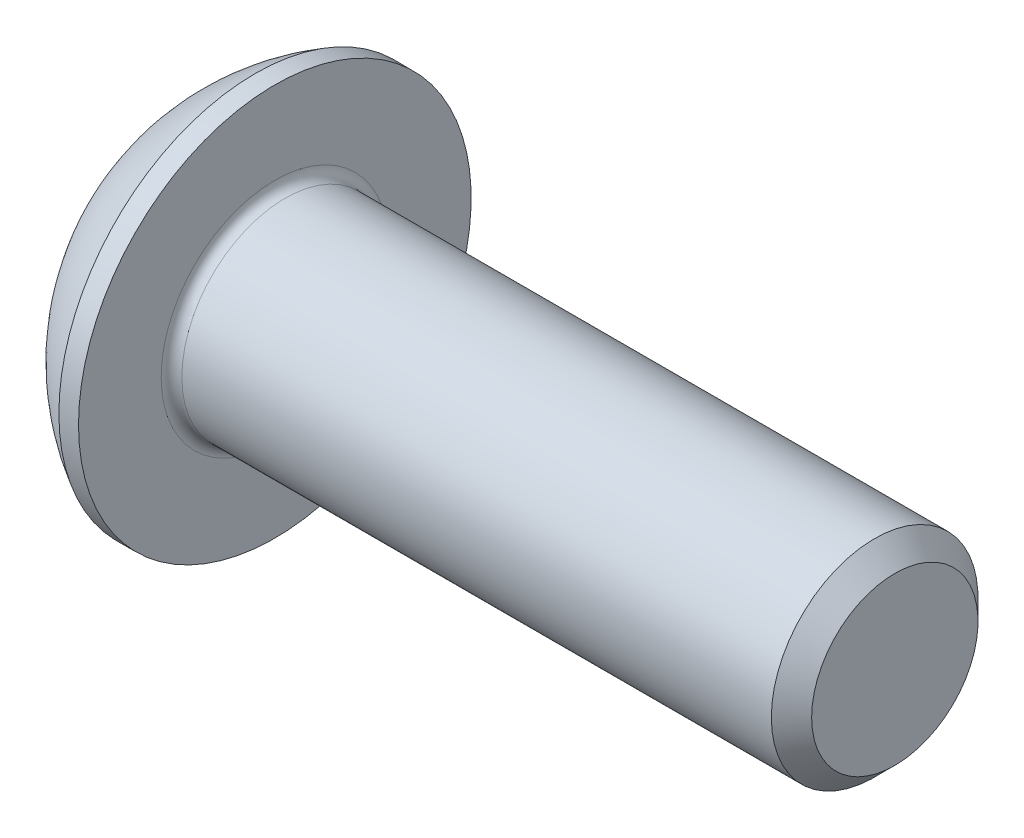
ISO-10303-21;
HEADER;
FILE_DESCRIPTION(('STEP AP214'),'2;1');
FILE_NAME('part.step','',(''),(''),'','','');
FILE_SCHEMA(('AUTOMOTIVE_DESIGN { 1 0 10303 214 1 1 1 1 }'));
ENDSEC;
DATA;
#1=APPLICATION_CONTEXT('core data for automotive mechanical design processes');
#2=APPLICATION_PROTOCOL_DEFINITION('international standard','automotive_design',2000,#1);
#3=PRODUCT_CONTEXT('',#1,'mechanical');
#4=PRODUCT('Part','Part','',(#3));
#5=PRODUCT_RELATED_PRODUCT_CATEGORY('part','',(#4));
#6=PRODUCT_DEFINITION_FORMATION('','',#4);
#7=PRODUCT_DEFINITION_CONTEXT('part definition',#1,'design');
#8=PRODUCT_DEFINITION('design','',#6,#7);
#9=PRODUCT_DEFINITION_SHAPE('','',#8);
#10=(LENGTH_UNIT() NAMED_UNIT(*) SI_UNIT(.MILLI.,.METRE.));
#11=(NAMED_UNIT(*) PLANE_ANGLE_UNIT() SI_UNIT($,.RADIAN.));
#12=(NAMED_UNIT(*) SI_UNIT($,.STERADIAN.) SOLID_ANGLE_UNIT());
#13=UNCERTAINTY_MEASURE_WITH_UNIT(LENGTH_MEASURE(1.E-05),#10,'distance_accuracy_value','');
#14=(GEOMETRIC_REPRESENTATION_CONTEXT(3) GLOBAL_UNCERTAINTY_ASSIGNED_CONTEXT((#13)) GLOBAL_UNIT_ASSIGNED_CONTEXT((#10,
#11,#12)) REPRESENTATION_CONTEXT('',''));
#15=CARTESIAN_POINT('',(0.,0.,0.));
#16=DIRECTION('',(0.,0.,1.));
#17=DIRECTION('',(1.,0.,0.));
#18=AXIS2_PLACEMENT_3D('',#15,#16,#17);
#19=CARTESIAN_POINT('',(0.,0.,0.));
#20=DIRECTION('',(-1.,0.,0.));
#21=DIRECTION('',(0.,0.,1.));
#22=AXIS2_PLACEMENT_3D('',#19,#20,#21);
#23=PLANE('',#22);
#24=CARTESIAN_POINT('',(0.,0.,0.));
#25=DIRECTION('',(-1.,0.,0.));
#26=DIRECTION('',(0.,0.,1.));
#27=AXIS2_PLACEMENT_3D('',#24,#25,#26);
#28=CIRCLE('',#27,1.9);
#29=CARTESIAN_POINT('',(0.,1.9,0.));
#30=VERTEX_POINT('',#29);
#31=EDGE_CURVE('E155',#30,#30,#28,.T.);
#32=ORIENTED_EDGE('',*,*,#31,.T.);
#33=EDGE_LOOP('',(#32));
#34=FACE_BOUND('',#33,.T.);
#35=DIRECTION('',(0.,-1.,0.));
#36=VECTOR('',#35,1.);
#37=CARTESIAN_POINT('',(0.,-0.721687836487032,1.25));
#38=LINE('',#37,#36);
#39=CARTESIAN_POINT('',(0.,0.721687836487034,1.25));
#40=VERTEX_POINT('',#39);
#41=CARTESIAN_POINT('',(0.,-0.721687836487032,1.25));
#42=VERTEX_POINT('',#41);
#43=EDGE_CURVE('E50',#40,#42,#38,.T.);
#44=ORIENTED_EDGE('',*,*,#43,.T.);
#45=DIRECTION('',(0.,-0.499999999999999,-0.866025403784439));
#46=VECTOR('',#45,1.);
#47=CARTESIAN_POINT('',(0.,-1.44337567297406,0.));
#48=LINE('',#47,#46);
#49=CARTESIAN_POINT('',(0.,-1.44337567297406,0.));
#50=VERTEX_POINT('',#49);
#51=EDGE_CURVE('E275',#42,#50,#48,.T.);
#52=ORIENTED_EDGE('',*,*,#51,.T.);
#53=DIRECTION('',(0.,0.499999999999999,-0.866025403784439));
#54=VECTOR('',#53,1.);
#55=CARTESIAN_POINT('',(0.,-0.721687836487033,-1.25));
#56=LINE('',#55,#54);
#57=CARTESIAN_POINT('',(0.,-0.721687836487033,-1.25));
#58=VERTEX_POINT('',#57);
#59=EDGE_CURVE('E130',#50,#58,#56,.T.);
#60=ORIENTED_EDGE('',*,*,#59,.T.);
#61=DIRECTION('',(0.,1.,0.));
#62=VECTOR('',#61,1.);
#63=CARTESIAN_POINT('',(0.,0.721687836487034,-1.25));
#64=LINE('',#63,#62);
#65=CARTESIAN_POINT('',(0.,0.721687836487034,-1.25));
#66=VERTEX_POINT('',#65);
#67=EDGE_CURVE('E278',#58,#66,#64,.T.);
#68=ORIENTED_EDGE('',*,*,#67,.T.);
#69=DIRECTION('',(0.,0.5,0.866025403784439));
#70=VECTOR('',#69,1.);
#71=CARTESIAN_POINT('',(0.,1.44337567297407,0.));
#72=LINE('',#71,#70);
#73=CARTESIAN_POINT('',(0.,1.44337567297407,0.));
#74=VERTEX_POINT('',#73);
#75=EDGE_CURVE('E280',#66,#74,#72,.T.);
#76=ORIENTED_EDGE('',*,*,#75,.T.);
#77=DIRECTION('',(0.,-0.499999999999999,0.866025403784439));
#78=VECTOR('',#77,1.);
#79=CARTESIAN_POINT('',(0.,0.721687836487034,1.25));
#80=LINE('',#79,#78);
#81=EDGE_CURVE('E282',#74,#40,#80,.T.);
#82=ORIENTED_EDGE('',*,*,#81,.T.);
#83=EDGE_LOOP('',(#44,#52,#60,#68,#76,#82));
#84=FACE_BOUND('',#83,.T.);
#85=ADVANCED_FACE('F35',(#34,#84),#23,.T.);
#86=CARTESIAN_POINT('',(3.88527472527473,0.,0.));
#87=DIRECTION('',(-1.,0.,0.));
#88=DIRECTION('',(0.,1.,0.));
#89=AXIS2_PLACEMENT_3D('',#86,#87,#88);
#90=SPHERICAL_SURFACE('',#89,4.32496932831421);
#91=CARTESIAN_POINT('',(1.82,0.,0.));
#92=DIRECTION('',(-1.,0.,0.));
#93=DIRECTION('',(0.,0.,1.));
#94=AXIS2_PLACEMENT_3D('',#91,#92,#93);
#95=CIRCLE('',#94,3.8);
#96=CARTESIAN_POINT('',(1.82,3.8,0.));
#97=VERTEX_POINT('',#96);
#98=EDGE_CURVE('E152',#97,#97,#95,.T.);
#99=CARTESIAN_POINT('',(1.82,3.8,0.));
#100=CARTESIAN_POINT('',(1.79553223778235,3.78670197498787,0.));
#101=CARTESIAN_POINT('',(1.77119294730718,3.77316757105695,0.));
#102=CARTESIAN_POINT('',(1.72278031308152,3.74563119292021,0.));
#103=CARTESIAN_POINT('',(1.69870696933104,3.7316292187144,0.));
#104=CARTESIAN_POINT('',(1.65083523179446,3.7031628875906,0.));
#105=CARTESIAN_POINT('',(1.62703683800837,3.6886985306726,0.));
#106=CARTESIAN_POINT('',(1.57972387446203,3.65931284095831,0.));
#107=CARTESIAN_POINT('',(1.55620930470177,3.64439150816201,0.));
#108=CARTESIAN_POINT('',(1.50947276449225,3.61409743150663,0.));
#109=CARTESIAN_POINT('',(1.48625079404298,3.59872468764754,0.));
#110=CARTESIAN_POINT('',(1.44010811665664,3.56753352546924,0.));
#111=CARTESIAN_POINT('',(1.41718740971957,3.55171510715004,0.));
#112=CARTESIAN_POINT('',(1.37165581166264,3.51963849804541,0.));
#113=CARTESIAN_POINT('',(1.34904492054277,3.50338030725998,0.));
#114=CARTESIAN_POINT('',(1.30414139068938,3.47043021954608,0.));
#115=CARTESIAN_POINT('',(1.28184875195586,3.4537383226176,0.));
#116=CARTESIAN_POINT('',(1.23759004473439,3.41992705070111,0.));
#117=CARTESIAN_POINT('',(1.21562397624644,3.40280767571308,0.));
#118=CARTESIAN_POINT('',(1.17202660551528,3.3681478352793,0.));
#119=CARTESIAN_POINT('',(1.15039530327208,3.35060736983354,0.));
#120=CARTESIAN_POINT('',(1.10747553612391,3.31511189319918,0.));
#121=CARTESIAN_POINT('',(1.08618707121895,3.29715688201057,0.));
#122=CARTESIAN_POINT('',(1.04396092192025,3.26083901328234,0.));
#123=CARTESIAN_POINT('',(1.02302323752652,3.24247615574272,0.));
#124=CARTESIAN_POINT('',(0.981506461539866,3.20534944588,0.));
#125=CARTESIAN_POINT('',(0.960927369946953,3.18658559355691,0.));
#126=CARTESIAN_POINT('',(0.920135458053,3.14866389531445,0.));
#127=CARTESIAN_POINT('',(0.89992263775196,3.12950604939509,0.));
#128=CARTESIAN_POINT('',(0.859870810269305,3.09080351215454,0.));
#129=CARTESIAN_POINT('',(0.84003180308769,3.07125882083336,0.));
#130=CARTESIAN_POINT('',(0.800735004193914,3.0317898853238,0.));
#131=CARTESIAN_POINT('',(0.781277212481753,3.01186564113541,0.));
#132=CARTESIAN_POINT('',(0.74275010463742,2.97164503404517,0.));
#133=CARTESIAN_POINT('',(0.723680788505248,2.95134867114332,0.));
#134=CARTESIAN_POINT('',(0.685937746983035,2.91039139962521,0.));
#135=CARTESIAN_POINT('',(0.667264021592994,2.88973049100894,0.));
#136=CARTESIAN_POINT('',(0.630319129113974,2.8480518370807,0.));
#137=CARTESIAN_POINT('',(0.612047962024996,2.82703409176873,0.));
#138=CARTESIAN_POINT('',(0.575915003504077,2.78464960661105,0.));
#139=CARTESIAN_POINT('',(0.558053212072136,2.76328286676534,0.));
#140=CARTESIAN_POINT('',(0.522745669474639,2.72020836491933,0.));
#141=CARTESIAN_POINT('',(0.505299918309083,2.69850060291903,0.));
#142=CARTESIAN_POINT('',(0.470830965620255,2.65475215638556,0.));
#143=CARTESIAN_POINT('',(0.453807764096984,2.63271147185238,0.));
#144=CARTESIAN_POINT('',(0.420190262406823,2.58830540409509,0.));
#145=CARTESIAN_POINT('',(0.403595962239934,2.56594002087097,0.));
#146=CARTESIAN_POINT('',(0.370842454943268,2.52089290072626,0.));
#147=CARTESIAN_POINT('',(0.35468324781349,2.49821116380567,0.));
#148=CARTESIAN_POINT('',(0.322805955934172,2.45253979929826,0.));
#149=CARTESIAN_POINT('',(0.307087871184633,2.42955017171145,0.));
#150=CARTESIAN_POINT('',(0.276098688799192,2.38327160379141,0.));
#151=CARTESIAN_POINT('',(0.26082759116329,2.35998266345818,0.));
#152=CARTESIAN_POINT('',(0.230738081024336,2.31311415961106,0.));
#153=CARTESIAN_POINT('',(0.215919668521285,2.28953459609717,0.));
#154=CARTESIAN_POINT('',(0.186741057514278,2.24209364401868,0.));
#155=CARTESIAN_POINT('',(0.172380859010322,2.21823225545407,0.));
#156=CARTESIAN_POINT('',(0.144124034818959,2.17023655608655,0.));
#157=CARTESIAN_POINT('',(0.130227409131551,2.14610224528364,0.));
#158=CARTESIAN_POINT('',(0.102902912986768,2.09756970784785,0.));
#159=CARTESIAN_POINT('',(0.0894750425293934,2.07317148121498,0.));
#160=CARTESIAN_POINT('',(0.0630930771761382,2.02412021042083,0.));
#161=CARTESIAN_POINT('',(0.0501389822802577,1.99946716625955,0.));
#162=CARTESIAN_POINT('',(0.0247093637594997,1.94991547834234,0.));
#163=CARTESIAN_POINT('',(0.0122338401346223,1.9250168345864,0.));
#164=CARTESIAN_POINT('',(0.,1.9,0.));
#165=B_SPLINE_CURVE_WITH_KNOTS('',3,(#99,#100,#101,#102,#103,#104,#105,#106,#107,#108,#109,#110,
#111,#112,#113,#114,#115,#116,#117,#118,#119,#120,#121,#122,#123,#124,#125,#126,#127,#128,#129,
#130,#131,#132,#133,#134,#135,#136,#137,#138,#139,#140,#141,#142,#143,#144,#145,#146,#147,#148,
#149,#150,#151,#152,#153,#154,#155,#156,#157,#158,#159,#160,#161,#162,#163,#164),.UNSPECIFIED.,
.F.,.F.,(4,2,2,2,2,2,2,2,2,2,2,2,2,2,2,2,2,2,2,2,2,2,2,2,2,2,2,2,2,2,2,2,4),(0.,
0.083542578086179,0.167085156172358,0.250627734258537,0.334170312344716,0.417712890430895,
0.501255468517074,0.584798046603253,0.668340624689433,0.751883202775612,0.835425780861791,
0.91896835894797,1.00251093703415,1.08605351512033,1.16959609320651,1.25313867129269,
1.33668124937887,1.42022382746505,1.50376640555122,1.5873089836374,1.67085156172358,
1.75439413980976,1.83793671789594,1.92147929598212,2.0050218740683,2.08856445215448,
2.17210703024066,2.25564960832684,2.33919218641301,2.42273476449919,2.50627734258537,
2.58981992067155,2.67336249875773),.UNSPECIFIED.);
#166=EDGE_CURVE('BSEAM176',#97,#30,#165,.T.);
#167=ORIENTED_EDGE('',*,*,#98,.T.);
#168=ORIENTED_EDGE('',*,*,#31,.F.);
#169=ORIENTED_EDGE('',*,*,#166,.T.);
#170=ORIENTED_EDGE('',*,*,#166,.F.);
#171=EDGE_LOOP('',(#167,#169,#168,#170));
#172=FACE_BOUND('',#171,.T.);
#173=ADVANCED_FACE('F176',(#172),#90,.T.);
#174=CARTESIAN_POINT('',(0.,0.,0.));
#175=DIRECTION('',(-1.,0.,0.));
#176=DIRECTION('',(0.,0.,1.));
#177=AXIS2_PLACEMENT_3D('',#174,#175,#176);
#178=CYLINDRICAL_SURFACE('',#177,3.8);
#179=ORIENTED_EDGE('',*,*,#98,.F.);
#180=EDGE_LOOP('',(#179));
#181=FACE_BOUND('',#180,.T.);
#182=CARTESIAN_POINT('',(2.2,0.,0.));
#183=DIRECTION('',(-1.,0.,0.));
#184=DIRECTION('',(0.,0.,1.));
#185=AXIS2_PLACEMENT_3D('',#182,#183,#184);
#186=CIRCLE('',#185,3.8);
#187=CARTESIAN_POINT('',(2.2,0.,3.8));
#188=VERTEX_POINT('',#187);
#189=EDGE_CURVE('E149',#188,#188,#186,.T.);
#190=ORIENTED_EDGE('',*,*,#189,.T.);
#191=EDGE_LOOP('',(#190));
#192=FACE_BOUND('',#191,.T.);
#193=ADVANCED_FACE('F181',(#181,#192),#178,.T.);
#194=CARTESIAN_POINT('',(2.2,1.99999999999999,0.));
#195=DIRECTION('',(-1.,0.,0.));
#196=DIRECTION('',(0.,0.,1.));
#197=AXIS2_PLACEMENT_3D('',#194,#195,#196);
#198=PLANE('',#197);
#199=CARTESIAN_POINT('',(2.2,0.,0.));
#200=DIRECTION('',(-1.,0.,0.));
#201=DIRECTION('',(0.,0.,1.));
#202=AXIS2_PLACEMENT_3D('',#199,#200,#201);
#203=CIRCLE('',#202,2.19999999999999);
#204=CARTESIAN_POINT('',(2.2,0.,2.19999999999999));
#205=VERTEX_POINT('',#204);
#206=EDGE_CURVE('E43',#205,#205,#203,.T.);
#207=ORIENTED_EDGE('',*,*,#206,.T.);
#208=EDGE_LOOP('',(#207));
#209=FACE_BOUND('',#208,.T.);
#210=ORIENTED_EDGE('',*,*,#189,.F.);
#211=EDGE_LOOP('',(#210));
#212=FACE_BOUND('',#211,.T.);
#213=ADVANCED_FACE('F160',(#209,#212),#198,.F.);
#214=CARTESIAN_POINT('',(0.,0.,0.));
#215=DIRECTION('',(-1.,0.,0.));
#216=DIRECTION('',(0.,0.,1.));
#217=AXIS2_PLACEMENT_3D('',#214,#215,#216);
#218=CYLINDRICAL_SURFACE('',#217,1.99999999999999);
#219=CARTESIAN_POINT('',(2.4,0.,0.));
#220=DIRECTION('',(-1.,0.,0.));
#221=DIRECTION('',(0.,0.,1.));
#222=AXIS2_PLACEMENT_3D('',#219,#220,#221);
#223=CIRCLE('',#222,1.99999999999999);
#224=CARTESIAN_POINT('',(2.4,0.,1.99999999999999));
#225=VERTEX_POINT('',#224);
#226=EDGE_CURVE('E11',#225,#225,#223,.F.);
#227=ORIENTED_EDGE('',*,*,#226,.T.);
#228=EDGE_LOOP('',(#227));
#229=FACE_BOUND('',#228,.T.);
#230=CARTESIAN_POINT('',(13.81,0.,0.));
#231=DIRECTION('',(-1.,0.,0.));
#232=DIRECTION('',(0.,0.,1.));
#233=AXIS2_PLACEMENT_3D('',#230,#231,#232);
#234=CIRCLE('',#233,1.99999999999999);
#235=CARTESIAN_POINT('',(13.81,0.,1.99999999999999));
#236=VERTEX_POINT('',#235);
#237=EDGE_CURVE('E146',#236,#236,#234,.T.);
#238=ORIENTED_EDGE('',*,*,#237,.T.);
#239=EDGE_LOOP('',(#238));
#240=FACE_BOUND('',#239,.T.);
#241=ADVANCED_FACE('F190',(#229,#240),#218,.T.);
#242=CARTESIAN_POINT('',(14.2,0.,0.));
#243=DIRECTION('',(-1.,0.,0.));
#244=DIRECTION('',(0.,0.,1.));
#245=AXIS2_PLACEMENT_3D('',#242,#243,#244);
#246=CONICAL_SURFACE('',#245,1.61,0.785398163397488);
#247=ORIENTED_EDGE('',*,*,#237,.F.);
#248=EDGE_LOOP('',(#247));
#249=FACE_BOUND('',#248,.T.);
#250=CARTESIAN_POINT('',(14.2,0.,0.));
#251=DIRECTION('',(-1.,0.,0.));
#252=DIRECTION('',(0.,0.,1.));
#253=AXIS2_PLACEMENT_3D('',#250,#251,#252);
#254=CIRCLE('',#253,1.61);
#255=CARTESIAN_POINT('',(14.2,0.,1.61));
#256=VERTEX_POINT('',#255);
#257=EDGE_CURVE('E142',#256,#256,#254,.T.);
#258=ORIENTED_EDGE('',*,*,#257,.T.);
#259=EDGE_LOOP('',(#258));
#260=FACE_BOUND('',#259,.T.);
#261=ADVANCED_FACE('F171',(#249,#260),#246,.T.);
#262=CARTESIAN_POINT('',(14.2,0.,0.));
#263=DIRECTION('',(-1.,0.,0.));
#264=DIRECTION('',(0.,0.,1.));
#265=AXIS2_PLACEMENT_3D('',#262,#263,#264);
#266=PLANE('',#265);
#267=ORIENTED_EDGE('',*,*,#257,.F.);
#268=EDGE_LOOP('',(#267));
#269=FACE_BOUND('',#268,.T.);
#270=ADVANCED_FACE('F164',(#269),#266,.F.);
#271=CARTESIAN_POINT('',(2.4,0.,0.));
#272=DIRECTION('',(-1.,0.,0.));
#273=DIRECTION('',(0.,0.,1.));
#274=AXIS2_PLACEMENT_3D('',#271,#272,#273);
#275=TOROIDAL_SURFACE('',#274,2.19999999999999,0.2);
#276=ORIENTED_EDGE('',*,*,#226,.F.);
#277=EDGE_LOOP('',(#276));
#278=FACE_BOUND('',#277,.T.);
#279=ORIENTED_EDGE('',*,*,#206,.F.);
#280=EDGE_LOOP('',(#279));
#281=FACE_BOUND('',#280,.T.);
#282=ADVANCED_FACE('F37',(#278,#281),#275,.F.);
#283=CARTESIAN_POINT('',(1.3,-1.44337567297406,0.));
#284=DIRECTION('',(0.,0.866025403784439,-0.499999999999999));
#285=DIRECTION('',(0.,0.499999999999999,0.866025403784439));
#286=AXIS2_PLACEMENT_3D('',#283,#284,#285);
#287=PLANE('',#286);
#288=DIRECTION('',(0.,-0.499999999999999,-0.866025403784439));
#289=VECTOR('',#288,1.);
#290=CARTESIAN_POINT('',(1.3,-1.44337567297406,0.));
#291=LINE('',#290,#289);
#292=CARTESIAN_POINT('',(1.3,-0.721687836487032,1.25));
#293=VERTEX_POINT('',#292);
#294=CARTESIAN_POINT('',(1.3,-1.08253175473055,0.624999999999999));
#295=VERTEX_POINT('',#294);
#296=EDGE_CURVE('E116',#293,#295,#291,.T.);
#297=ORIENTED_EDGE('',*,*,#296,.T.);
#298=CARTESIAN_POINT('',(1.3,-1.44337567297406,0.));
#299=VERTEX_POINT('',#298);
#300=EDGE_CURVE('E111',#295,#299,#291,.T.);
#301=ORIENTED_EDGE('',*,*,#300,.T.);
#302=DIRECTION('',(-1.,0.,0.));
#303=VECTOR('',#302,1.);
#304=CARTESIAN_POINT('',(1.3,-1.44337567297406,0.));
#305=LINE('',#304,#303);
#306=EDGE_CURVE('E113',#299,#50,#305,.T.);
#307=ORIENTED_EDGE('',*,*,#306,.T.);
#308=ORIENTED_EDGE('',*,*,#51,.F.);
#309=DIRECTION('',(-1.,0.,0.));
#310=VECTOR('',#309,1.);
#311=CARTESIAN_POINT('',(1.3,-0.721687836487032,1.25));
#312=LINE('',#311,#310);
#313=EDGE_CURVE('E271',#293,#42,#312,.T.);
#314=ORIENTED_EDGE('',*,*,#313,.F.);
#315=EDGE_LOOP('',(#297,#301,#307,#308,#314));
#316=FACE_BOUND('',#315,.T.);
#317=ADVANCED_FACE('F112',(#316),#287,.T.);
#318=CARTESIAN_POINT('',(1.3,-0.721687836487033,-1.25));
#319=DIRECTION('',(0.,0.866025403784439,0.499999999999999));
#320=DIRECTION('',(0.,-0.499999999999999,0.866025403784439));
#321=AXIS2_PLACEMENT_3D('',#318,#319,#320);
#322=PLANE('',#321);
#323=DIRECTION('',(0.,0.499999999999999,-0.866025403784439));
#324=VECTOR('',#323,1.);
#325=CARTESIAN_POINT('',(1.3,-0.721687836487033,-1.25));
#326=LINE('',#325,#324);
#327=CARTESIAN_POINT('',(1.3,-1.08253175473055,-0.624999999999999));
#328=VERTEX_POINT('',#327);
#329=EDGE_CURVE('E58',#299,#328,#326,.T.);
#330=ORIENTED_EDGE('',*,*,#329,.T.);
#331=CARTESIAN_POINT('',(1.3,-0.721687836487033,-1.25));
#332=VERTEX_POINT('',#331);
#333=EDGE_CURVE('E125',#328,#332,#326,.T.);
#334=ORIENTED_EDGE('',*,*,#333,.T.);
#335=DIRECTION('',(-1.,0.,0.));
#336=VECTOR('',#335,1.);
#337=CARTESIAN_POINT('',(1.3,-0.721687836487033,-1.25));
#338=LINE('',#337,#336);
#339=EDGE_CURVE('E132',#332,#58,#338,.T.);
#340=ORIENTED_EDGE('',*,*,#339,.T.);
#341=ORIENTED_EDGE('',*,*,#59,.F.);
#342=ORIENTED_EDGE('',*,*,#306,.F.);
#343=EDGE_LOOP('',(#330,#334,#340,#341,#342));
#344=FACE_BOUND('',#343,.T.);
#345=ADVANCED_FACE('F128',(#344),#322,.T.);
#346=CARTESIAN_POINT('',(1.3,0.721687836487034,-1.25));
#347=DIRECTION('',(0.,0.,1.));
#348=DIRECTION('',(1.,0.,0.));
#349=AXIS2_PLACEMENT_3D('',#346,#347,#348);
#350=PLANE('',#349);
#351=DIRECTION('',(0.,1.,0.));
#352=VECTOR('',#351,1.);
#353=CARTESIAN_POINT('',(1.3,0.721687836487034,-1.25));
#354=LINE('',#353,#352);
#355=CARTESIAN_POINT('',(1.3,0.,-1.25));
#356=VERTEX_POINT('',#355);
#357=EDGE_CURVE('E252',#332,#356,#354,.T.);
#358=ORIENTED_EDGE('',*,*,#357,.T.);
#359=CARTESIAN_POINT('',(1.3,0.721687836487034,-1.25));
#360=VERTEX_POINT('',#359);
#361=EDGE_CURVE('E124',#356,#360,#354,.T.);
#362=ORIENTED_EDGE('',*,*,#361,.T.);
#363=DIRECTION('',(-1.,0.,0.));
#364=VECTOR('',#363,1.);
#365=CARTESIAN_POINT('',(1.3,0.721687836487034,-1.25));
#366=LINE('',#365,#364);
#367=EDGE_CURVE('E137',#360,#66,#366,.T.);
#368=ORIENTED_EDGE('',*,*,#367,.T.);
#369=ORIENTED_EDGE('',*,*,#67,.F.);
#370=ORIENTED_EDGE('',*,*,#339,.F.);
#371=EDGE_LOOP('',(#358,#362,#368,#369,#370));
#372=FACE_BOUND('',#371,.T.);
#373=ADVANCED_FACE('F204',(#372),#350,.T.);
#374=CARTESIAN_POINT('',(1.3,1.44337567297407,0.));
#375=DIRECTION('',(0.,-0.866025403784439,0.5));
#376=DIRECTION('',(0.,-0.5,-0.866025403784439));
#377=AXIS2_PLACEMENT_3D('',#374,#375,#376);
#378=PLANE('',#377);
#379=DIRECTION('',(0.,0.5,0.866025403784439));
#380=VECTOR('',#379,1.);
#381=CARTESIAN_POINT('',(1.3,1.44337567297407,0.));
#382=LINE('',#381,#380);
#383=CARTESIAN_POINT('',(1.3,1.08253175473055,-0.625));
#384=VERTEX_POINT('',#383);
#385=EDGE_CURVE('E241',#360,#384,#382,.T.);
#386=ORIENTED_EDGE('',*,*,#385,.T.);
#387=CARTESIAN_POINT('',(1.3,1.44337567297407,0.));
#388=VERTEX_POINT('',#387);
#389=EDGE_CURVE('E246',#384,#388,#382,.T.);
#390=ORIENTED_EDGE('',*,*,#389,.T.);
#391=DIRECTION('',(-1.,0.,0.));
#392=VECTOR('',#391,1.);
#393=CARTESIAN_POINT('',(1.3,1.44337567297407,0.));
#394=LINE('',#393,#392);
#395=EDGE_CURVE('E286',#388,#74,#394,.T.);
#396=ORIENTED_EDGE('',*,*,#395,.T.);
#397=ORIENTED_EDGE('',*,*,#75,.F.);
#398=ORIENTED_EDGE('',*,*,#367,.F.);
#399=EDGE_LOOP('',(#386,#390,#396,#397,#398));
#400=FACE_BOUND('',#399,.T.);
#401=ADVANCED_FACE('F207',(#400),#378,.T.);
#402=CARTESIAN_POINT('',(1.3,0.721687836487034,1.25));
#403=DIRECTION('',(0.,-0.866025403784439,-0.499999999999999));
#404=DIRECTION('',(0.,0.499999999999999,-0.866025403784439));
#405=AXIS2_PLACEMENT_3D('',#402,#403,#404);
#406=PLANE('',#405);
#407=DIRECTION('',(0.,-0.499999999999999,0.866025403784439));
#408=VECTOR('',#407,1.);
#409=CARTESIAN_POINT('',(1.3,0.721687836487034,1.25));
#410=LINE('',#409,#408);
#411=CARTESIAN_POINT('',(1.3,1.08253175473055,0.625));
#412=VERTEX_POINT('',#411);
#413=EDGE_CURVE('E249',#388,#412,#410,.T.);
#414=ORIENTED_EDGE('',*,*,#413,.T.);
#415=CARTESIAN_POINT('',(1.3,0.721687836487034,1.25));
#416=VERTEX_POINT('',#415);
#417=EDGE_CURVE('E257',#412,#416,#410,.T.);
#418=ORIENTED_EDGE('',*,*,#417,.T.);
#419=DIRECTION('',(-1.,0.,0.));
#420=VECTOR('',#419,1.);
#421=CARTESIAN_POINT('',(1.3,0.721687836487034,1.25));
#422=LINE('',#421,#420);
#423=EDGE_CURVE('E270',#416,#40,#422,.T.);
#424=ORIENTED_EDGE('',*,*,#423,.T.);
#425=ORIENTED_EDGE('',*,*,#81,.F.);
#426=ORIENTED_EDGE('',*,*,#395,.F.);
#427=EDGE_LOOP('',(#414,#418,#424,#425,#426));
#428=FACE_BOUND('',#427,.T.);
#429=ADVANCED_FACE('F211',(#428),#406,.T.);
#430=CARTESIAN_POINT('',(1.3,-0.721687836487032,1.25));
#431=DIRECTION('',(0.,0.,-1.));
#432=DIRECTION('',(0.,1.,0.));
#433=AXIS2_PLACEMENT_3D('',#430,#431,#432);
#434=PLANE('',#433);
#435=DIRECTION('',(0.,-1.,0.));
#436=VECTOR('',#435,1.);
#437=CARTESIAN_POINT('',(1.3,-0.721687836487032,1.25));
#438=LINE('',#437,#436);
#439=CARTESIAN_POINT('',(1.3,0.,1.25));
#440=VERTEX_POINT('',#439);
#441=EDGE_CURVE('E263',#416,#440,#438,.T.);
#442=ORIENTED_EDGE('',*,*,#441,.T.);
#443=EDGE_CURVE('E265',#440,#293,#438,.T.);
#444=ORIENTED_EDGE('',*,*,#443,.T.);
#445=ORIENTED_EDGE('',*,*,#313,.T.);
#446=ORIENTED_EDGE('',*,*,#43,.F.);
#447=ORIENTED_EDGE('',*,*,#423,.F.);
#448=EDGE_LOOP('',(#442,#444,#445,#446,#447));
#449=FACE_BOUND('',#448,.T.);
#450=ADVANCED_FACE('F215',(#449),#434,.T.);
#451=CARTESIAN_POINT('',(1.3,-2.16506350946109,-1.25));
#452=DIRECTION('',(1.,0.,0.));
#453=DIRECTION('',(0.,0.,-1.));
#454=AXIS2_PLACEMENT_3D('',#451,#452,#453);
#455=PLANE('',#454);
#456=CARTESIAN_POINT('',(1.3,0.,0.));
#457=DIRECTION('',(-1.,0.,0.));
#458=DIRECTION('',(0.,0.,1.));
#459=AXIS2_PLACEMENT_3D('',#456,#457,#458);
#460=CIRCLE('',#459,1.25);
#461=EDGE_CURVE('E238',#384,#356,#460,.T.);
#462=ORIENTED_EDGE('',*,*,#461,.F.);
#463=ORIENTED_EDGE('',*,*,#385,.F.);
#464=ORIENTED_EDGE('',*,*,#361,.F.);
#465=EDGE_LOOP('',(#462,#463,#464));
#466=FACE_BOUND('',#465,.T.);
#467=ADVANCED_FACE('F219',(#466),#455,.F.);
#468=EDGE_CURVE('E143',#412,#384,#460,.T.);
#469=ORIENTED_EDGE('',*,*,#468,.F.);
#470=ORIENTED_EDGE('',*,*,#413,.F.);
#471=ORIENTED_EDGE('',*,*,#389,.F.);
#472=EDGE_LOOP('',(#469,#470,#471));
#473=FACE_BOUND('',#472,.T.);
#474=ADVANCED_FACE('F228',(#473),#455,.F.);
#475=EDGE_CURVE('E136',#440,#412,#460,.T.);
#476=ORIENTED_EDGE('',*,*,#475,.F.);
#477=ORIENTED_EDGE('',*,*,#441,.F.);
#478=ORIENTED_EDGE('',*,*,#417,.F.);
#479=EDGE_LOOP('',(#476,#477,#478));
#480=FACE_BOUND('',#479,.T.);
#481=ADVANCED_FACE('F233',(#480),#455,.F.);
#482=EDGE_CURVE('E131',#295,#440,#460,.T.);
#483=ORIENTED_EDGE('',*,*,#482,.F.);
#484=ORIENTED_EDGE('',*,*,#296,.F.);
#485=ORIENTED_EDGE('',*,*,#443,.F.);
#486=EDGE_LOOP('',(#483,#484,#485));
#487=FACE_BOUND('',#486,.T.);
#488=ADVANCED_FACE('F226',(#487),#455,.F.);
#489=EDGE_CURVE('E122',#328,#295,#460,.T.);
#490=ORIENTED_EDGE('',*,*,#489,.F.);
#491=ORIENTED_EDGE('',*,*,#329,.F.);
#492=ORIENTED_EDGE('',*,*,#300,.F.);
#493=EDGE_LOOP('',(#490,#491,#492));
#494=FACE_BOUND('',#493,.T.);
#495=ADVANCED_FACE('F121',(#494),#455,.F.);
#496=EDGE_CURVE('E244',#356,#328,#460,.T.);
#497=ORIENTED_EDGE('',*,*,#496,.F.);
#498=ORIENTED_EDGE('',*,*,#357,.F.);
#499=ORIENTED_EDGE('',*,*,#333,.F.);
#500=EDGE_LOOP('',(#497,#498,#499));
#501=FACE_BOUND('',#500,.T.);
#502=ADVANCED_FACE('F199',(#501),#455,.F.);
#503=CARTESIAN_POINT('',(2.02168783648704,0.,0.));
#504=DIRECTION('',(-1.,0.,0.));
#505=DIRECTION('',(0.,0.,1.));
#506=AXIS2_PLACEMENT_3D('',#503,#504,#505);
#507=CONICAL_SURFACE('',#506,0.,1.04719755119659);
#508=ORIENTED_EDGE('',*,*,#475,.T.);
#509=ORIENTED_EDGE('',*,*,#468,.T.);
#510=ORIENTED_EDGE('',*,*,#461,.T.);
#511=ORIENTED_EDGE('',*,*,#496,.T.);
#512=ORIENTED_EDGE('',*,*,#489,.T.);
#513=ORIENTED_EDGE('',*,*,#482,.T.);
#514=EDGE_LOOP('',(#508,#509,#510,#511,#512,#513));
#515=FACE_BOUND('',#514,.T.);
#516=CARTESIAN_POINT('',(2.02168783648704,0.,0.));
#517=VERTEX_POINT('',#516);
#518=VERTEX_LOOP('',#517);
#519=FACE_BOUND('',#518,.T.);
#520=ADVANCED_FACE('F197',(#515,#519),#507,.F.);
#521=CLOSED_SHELL('',(#85,#173,#193,#213,#241,#261,#270,#282,#317,#345,#373,#401,#429,#450,#467,
#474,#481,#488,#495,#502,#520));
#522=MANIFOLD_SOLID_BREP('B2',#521);
#523=ADVANCED_BREP_SHAPE_REPRESENTATION('',(#18,#522),#14);
#524=SHAPE_DEFINITION_REPRESENTATION(#9,#523);
ENDSEC;
END-ISO-10303-21;
